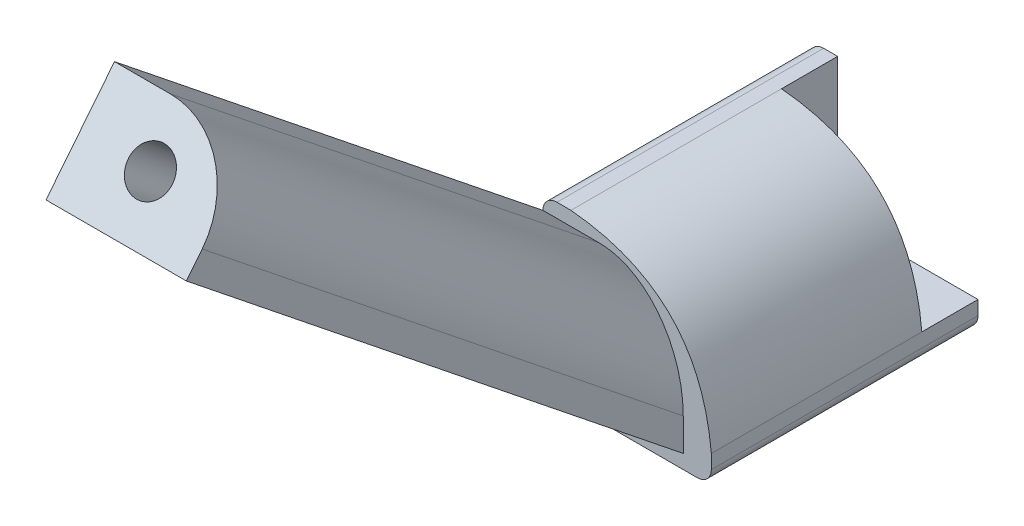
ISO-10303-21;
HEADER;
FILE_DESCRIPTION(('STEP AP214'),'2;1');
FILE_NAME('part.step','',(''),(''),'','','');
FILE_SCHEMA(('AUTOMOTIVE_DESIGN { 1 0 10303 214 1 1 1 1 }'));
ENDSEC;
DATA;
#1=APPLICATION_CONTEXT('core data for automotive mechanical design processes');
#2=APPLICATION_PROTOCOL_DEFINITION('international standard','automotive_design',2000,#1);
#3=PRODUCT_CONTEXT('',#1,'mechanical');
#4=PRODUCT('Part','Part','',(#3));
#5=PRODUCT_RELATED_PRODUCT_CATEGORY('part','',(#4));
#6=PRODUCT_DEFINITION_FORMATION('','',#4);
#7=PRODUCT_DEFINITION_CONTEXT('part definition',#1,'design');
#8=PRODUCT_DEFINITION('design','',#6,#7);
#9=PRODUCT_DEFINITION_SHAPE('','',#8);
#10=(LENGTH_UNIT() NAMED_UNIT(*) SI_UNIT(.MILLI.,.METRE.));
#11=(NAMED_UNIT(*) PLANE_ANGLE_UNIT() SI_UNIT($,.RADIAN.));
#12=(NAMED_UNIT(*) SI_UNIT($,.STERADIAN.) SOLID_ANGLE_UNIT());
#13=UNCERTAINTY_MEASURE_WITH_UNIT(LENGTH_MEASURE(1.E-05),#10,'distance_accuracy_value','');
#14=(GEOMETRIC_REPRESENTATION_CONTEXT(3) GLOBAL_UNCERTAINTY_ASSIGNED_CONTEXT((#13)) GLOBAL_UNIT_ASSIGNED_CONTEXT((#10,
#11,#12)) REPRESENTATION_CONTEXT('',''));
#15=CARTESIAN_POINT('',(0.,0.,0.));
#16=DIRECTION('',(0.,0.,1.));
#17=DIRECTION('',(1.,0.,0.));
#18=AXIS2_PLACEMENT_3D('',#15,#16,#17);
#19=CARTESIAN_POINT('',(8.98515136267974,8.98515136267974,6.35));
#20=DIRECTION('',(0.,0.,1.));
#21=DIRECTION('',(1.,0.,0.));
#22=AXIS2_PLACEMENT_3D('',#19,#20,#21);
#23=PLANE('',#22);
#24=CARTESIAN_POINT('',(5.08,5.08,6.35));
#25=DIRECTION('',(0.,0.,1.));
#26=DIRECTION('',(1.,0.,0.));
#27=AXIS2_PLACEMENT_3D('',#24,#25,#26);
#28=CIRCLE('',#27,1.2);
#29=CARTESIAN_POINT('',(6.28,5.08,6.35));
#30=VERTEX_POINT('',#29);
#31=EDGE_CURVE('E206',#30,#30,#28,.T.);
#32=ORIENTED_EDGE('',*,*,#31,.F.);
#33=EDGE_LOOP('',(#32));
#34=FACE_BOUND('',#33,.T.);
#35=CARTESIAN_POINT('',(5.08,5.08,6.35));
#36=DIRECTION('',(0.,0.,1.));
#37=DIRECTION('',(1.,0.,0.));
#38=AXIS2_PLACEMENT_3D('',#35,#36,#37);
#39=CIRCLE('',#38,3.175);
#40=CARTESIAN_POINT('',(8.255,5.08,6.35));
#41=VERTEX_POINT('',#40);
#42=EDGE_CURVE('E177',#41,#41,#39,.T.);
#43=ORIENTED_EDGE('',*,*,#42,.T.);
#44=EDGE_LOOP('',(#43));
#45=FACE_BOUND('',#44,.T.);
#46=ADVANCED_FACE('F39',(#34,#45),#23,.T.);
#47=CARTESIAN_POINT('',(8.98515136267031,8.98515136267032,0.));
#48=DIRECTION('',(0.,0.,1.));
#49=DIRECTION('',(1.,0.,0.));
#50=AXIS2_PLACEMENT_3D('',#47,#48,#49);
#51=PLANE('',#50);
#52=DIRECTION('',(0.,-1.,0.));
#53=VECTOR('',#52,1.);
#54=CARTESIAN_POINT('',(0.,0.,0.));
#55=LINE('',#54,#53);
#56=CARTESIAN_POINT('',(0.,12.7,0.));
#57=VERTEX_POINT('',#56);
#58=CARTESIAN_POINT('',(0.,0.,0.));
#59=VERTEX_POINT('',#58);
#60=EDGE_CURVE('E271',#57,#59,#55,.T.);
#61=ORIENTED_EDGE('',*,*,#60,.F.);
#62=CARTESIAN_POINT('',(12.7,0.,0.));
#63=CARTESIAN_POINT('',(11.6203027253406,11.6203027253406,0.));
#64=CARTESIAN_POINT('',(0.,12.7,0.));
#65=B_SPLINE_CURVE_WITH_KNOTS('',2,(#62,#63,#64),.UNSPECIFIED.,.F.,.F.,(3,3),(0.,1.),.UNSPECIFIED.);
#66=CARTESIAN_POINT('',(12.7,0.,0.));
#67=VERTEX_POINT('',#66);
#68=EDGE_CURVE('E431',#67,#57,#65,.T.);
#69=ORIENTED_EDGE('',*,*,#68,.F.);
#70=DIRECTION('',(1.,0.,0.));
#71=VECTOR('',#70,1.);
#72=CARTESIAN_POINT('',(0.,0.,0.));
#73=LINE('',#72,#71);
#74=EDGE_CURVE('E275',#59,#67,#73,.T.);
#75=ORIENTED_EDGE('',*,*,#74,.F.);
#76=EDGE_LOOP('',(#61,#69,#75));
#77=FACE_BOUND('',#76,.T.);
#78=CARTESIAN_POINT('',(5.08,5.08,0.));
#79=DIRECTION('',(0.,0.,1.));
#80=DIRECTION('',(1.,0.,0.));
#81=AXIS2_PLACEMENT_3D('',#78,#79,#80);
#82=CIRCLE('',#81,3.1115);
#83=CARTESIAN_POINT('',(1.9685,5.08,0.));
#84=VERTEX_POINT('',#83);
#85=EDGE_CURVE('E266',#84,#84,#82,.T.);
#86=ORIENTED_EDGE('',*,*,#85,.T.);
#87=EDGE_LOOP('',(#86));
#88=FACE_BOUND('',#87,.T.);
#89=ADVANCED_FACE('F289',(#77,#88),#51,.F.);
#90=CARTESIAN_POINT('',(12.7,0.,3.81));
#91=CARTESIAN_POINT('',(11.6203027253406,11.6203027253406,3.81));
#92=CARTESIAN_POINT('',(0.,12.7,3.81));
#93=B_SPLINE_CURVE_WITH_KNOTS('',2,(#90,#91,#92),.UNSPECIFIED.,.F.,.F.,(3,3),(0.,1.),.UNSPECIFIED.);
#94=DIRECTION('',(0.,0.,-1.));
#95=VECTOR('',#94,1.);
#96=SURFACE_OF_LINEAR_EXTRUSION('',#93,#95);
#97=ORIENTED_EDGE('',*,*,#68,.T.);
#98=DIRECTION('',(0.,0.,-1.));
#99=VECTOR('',#98,1.);
#100=CARTESIAN_POINT('',(0.,12.7,3.81));
#101=LINE('',#100,#99);
#102=CARTESIAN_POINT('',(0.,12.7,19.05));
#103=VERTEX_POINT('',#102);
#104=EDGE_CURVE('E417',#103,#57,#101,.T.);
#105=ORIENTED_EDGE('',*,*,#104,.F.);
#106=CARTESIAN_POINT('',(12.7,0.,19.05));
#107=CARTESIAN_POINT('',(11.6203027253595,11.6203027253595,19.05));
#108=CARTESIAN_POINT('',(0.,12.7,19.05));
#109=B_SPLINE_CURVE_WITH_KNOTS('',2,(#106,#107,#108),.UNSPECIFIED.,.F.,.F.,(3,3),(0.,1.),.UNSPECIFIED.);
#110=CARTESIAN_POINT('',(12.7,0.,19.05));
#111=VERTEX_POINT('',#110);
#112=EDGE_CURVE('E180',#111,#103,#109,.T.);
#113=ORIENTED_EDGE('',*,*,#112,.F.);
#114=DIRECTION('',(0.,0.,-1.));
#115=VECTOR('',#114,1.);
#116=CARTESIAN_POINT('',(12.7,0.,3.81));
#117=LINE('',#116,#115);
#118=EDGE_CURVE('E165',#111,#67,#117,.T.);
#119=ORIENTED_EDGE('',*,*,#118,.T.);
#120=EDGE_LOOP('',(#97,#105,#113,#119));
#121=FACE_BOUND('',#120,.T.);
#122=ADVANCED_FACE('F285',(#121),#96,.F.);
#123=CARTESIAN_POINT('',(5.08,5.08,3.81));
#124=DIRECTION('',(0.,0.,-1.));
#125=DIRECTION('',(-1.,0.,0.));
#126=AXIS2_PLACEMENT_3D('',#123,#124,#125);
#127=CYLINDRICAL_SURFACE('',#126,3.1115);
#128=CARTESIAN_POINT('',(5.08,5.08,3.81));
#129=DIRECTION('',(0.,0.,1.));
#130=DIRECTION('',(1.,0.,0.));
#131=AXIS2_PLACEMENT_3D('',#128,#129,#130);
#132=CIRCLE('',#131,3.1115);
#133=CARTESIAN_POINT('',(1.9685,5.08,3.81));
#134=VERTEX_POINT('',#133);
#135=EDGE_CURVE('E209',#134,#134,#132,.T.);
#136=CARTESIAN_POINT('',(1.9685,5.08,3.81));
#137=CARTESIAN_POINT('',(1.9685,5.08,3.7703125));
#138=CARTESIAN_POINT('',(1.9685,5.08,3.730625));
#139=CARTESIAN_POINT('',(1.9685,5.08,3.65125));
#140=CARTESIAN_POINT('',(1.9685,5.08,3.6115625));
#141=CARTESIAN_POINT('',(1.9685,5.08,3.5321875));
#142=CARTESIAN_POINT('',(1.9685,5.08,3.4925));
#143=CARTESIAN_POINT('',(1.9685,5.08,3.413125));
#144=CARTESIAN_POINT('',(1.9685,5.08,3.3734375));
#145=CARTESIAN_POINT('',(1.9685,5.08,3.2940625));
#146=CARTESIAN_POINT('',(1.9685,5.08,3.254375));
#147=CARTESIAN_POINT('',(1.9685,5.08,3.175));
#148=CARTESIAN_POINT('',(1.9685,5.08,3.1353125));
#149=CARTESIAN_POINT('',(1.9685,5.08,3.0559375));
#150=CARTESIAN_POINT('',(1.9685,5.08,3.01625));
#151=CARTESIAN_POINT('',(1.9685,5.08,2.936875));
#152=CARTESIAN_POINT('',(1.9685,5.08,2.8971875));
#153=CARTESIAN_POINT('',(1.9685,5.08,2.8178125));
#154=CARTESIAN_POINT('',(1.9685,5.08,2.778125));
#155=CARTESIAN_POINT('',(1.9685,5.08,2.69875));
#156=CARTESIAN_POINT('',(1.9685,5.08,2.6590625));
#157=CARTESIAN_POINT('',(1.9685,5.08,2.5796875));
#158=CARTESIAN_POINT('',(1.9685,5.08,2.54));
#159=CARTESIAN_POINT('',(1.9685,5.08,2.460625));
#160=CARTESIAN_POINT('',(1.9685,5.08,2.4209375));
#161=CARTESIAN_POINT('',(1.9685,5.08,2.3415625));
#162=CARTESIAN_POINT('',(1.9685,5.08,2.301875));
#163=CARTESIAN_POINT('',(1.9685,5.08,2.2225));
#164=CARTESIAN_POINT('',(1.9685,5.08,2.1828125));
#165=CARTESIAN_POINT('',(1.9685,5.08,2.1034375));
#166=CARTESIAN_POINT('',(1.9685,5.08,2.06375));
#167=CARTESIAN_POINT('',(1.9685,5.08,1.984375));
#168=CARTESIAN_POINT('',(1.9685,5.08,1.9446875));
#169=CARTESIAN_POINT('',(1.9685,5.08,1.8653125));
#170=CARTESIAN_POINT('',(1.9685,5.08,1.825625));
#171=CARTESIAN_POINT('',(1.9685,5.08,1.74625));
#172=CARTESIAN_POINT('',(1.9685,5.08,1.7065625));
#173=CARTESIAN_POINT('',(1.9685,5.08,1.6271875));
#174=CARTESIAN_POINT('',(1.9685,5.08,1.5875));
#175=CARTESIAN_POINT('',(1.9685,5.08,1.508125));
#176=CARTESIAN_POINT('',(1.9685,5.08,1.4684375));
#177=CARTESIAN_POINT('',(1.9685,5.08,1.3890625));
#178=CARTESIAN_POINT('',(1.9685,5.08,1.349375));
#179=CARTESIAN_POINT('',(1.9685,5.08,1.27));
#180=CARTESIAN_POINT('',(1.9685,5.08,1.2303125));
#181=CARTESIAN_POINT('',(1.9685,5.08,1.1509375));
#182=CARTESIAN_POINT('',(1.9685,5.08,1.11125));
#183=CARTESIAN_POINT('',(1.9685,5.08,1.031875));
#184=CARTESIAN_POINT('',(1.9685,5.08,0.9921875));
#185=CARTESIAN_POINT('',(1.9685,5.08,0.9128125));
#186=CARTESIAN_POINT('',(1.9685,5.08,0.873125));
#187=CARTESIAN_POINT('',(1.9685,5.08,0.79375));
#188=CARTESIAN_POINT('',(1.9685,5.08,0.7540625));
#189=CARTESIAN_POINT('',(1.9685,5.08,0.6746875));
#190=CARTESIAN_POINT('',(1.9685,5.08,0.635));
#191=CARTESIAN_POINT('',(1.9685,5.08,0.555625));
#192=CARTESIAN_POINT('',(1.9685,5.08,0.5159375));
#193=CARTESIAN_POINT('',(1.9685,5.08,0.4365625));
#194=CARTESIAN_POINT('',(1.9685,5.08,0.396875));
#195=CARTESIAN_POINT('',(1.9685,5.08,0.3175));
#196=CARTESIAN_POINT('',(1.9685,5.08,0.2778125));
#197=CARTESIAN_POINT('',(1.9685,5.08,0.1984375));
#198=CARTESIAN_POINT('',(1.9685,5.08,0.15875));
#199=CARTESIAN_POINT('',(1.9685,5.08,0.0793749999999999));
#200=CARTESIAN_POINT('',(1.9685,5.08,0.0396874999999999));
#201=CARTESIAN_POINT('',(1.9685,5.08,0.));
#202=B_SPLINE_CURVE_WITH_KNOTS('',3,(#136,#137,#138,#139,#140,#141,#142,#143,#144,#145,#146,
#147,#148,#149,#150,#151,#152,#153,#154,#155,#156,#157,#158,#159,#160,#161,#162,#163,#164,#165,
#166,#167,#168,#169,#170,#171,#172,#173,#174,#175,#176,#177,#178,#179,#180,#181,#182,#183,#184,
#185,#186,#187,#188,#189,#190,#191,#192,#193,#194,#195,#196,#197,#198,#199,#200,#201),
.UNSPECIFIED.,.F.,.F.,(4,2,2,2,2,2,2,2,2,2,2,2,2,2,2,2,2,2,2,2,2,2,2,2,2,2,2,2,2,2,2,2,4),(0.,
0.1190625,0.238125,0.3571875,0.47625,0.5953125,0.714375,0.8334375,0.9525,1.0715625,1.190625,
1.3096875,1.42875,1.5478125,1.666875,1.7859375,1.905,2.0240625,2.143125,2.2621875,2.38125,
2.5003125,2.619375,2.7384375,2.8575,2.9765625,3.095625,3.2146875,3.33375,3.4528125,3.571875,
3.6909375,3.81),.UNSPECIFIED.);
#203=EDGE_CURVE('BSEAM288',#134,#84,#202,.T.);
#204=ORIENTED_EDGE('',*,*,#135,.T.);
#205=ORIENTED_EDGE('',*,*,#85,.F.);
#206=ORIENTED_EDGE('',*,*,#203,.T.);
#207=ORIENTED_EDGE('',*,*,#203,.F.);
#208=EDGE_LOOP('',(#204,#206,#205,#207));
#209=FACE_BOUND('',#208,.T.);
#210=ADVANCED_FACE('F288',(#209),#127,.F.);
#211=CARTESIAN_POINT('',(0.,0.,3.81));
#212=DIRECTION('',(0.,1.,0.));
#213=DIRECTION('',(0.,0.,1.));
#214=AXIS2_PLACEMENT_3D('',#211,#212,#213);
#215=PLANE('',#214);
#216=ORIENTED_EDGE('',*,*,#74,.T.);
#217=DIRECTION('',(0.,0.,-1.));
#218=VECTOR('',#217,1.);
#219=CARTESIAN_POINT('',(12.7,0.,3.81));
#220=LINE('',#219,#218);
#221=CARTESIAN_POINT('',(12.7,0.,-5.08));
#222=VERTEX_POINT('',#221);
#223=EDGE_CURVE('E251',#67,#222,#220,.T.);
#224=ORIENTED_EDGE('',*,*,#223,.T.);
#225=DIRECTION('',(1.,0.,0.));
#226=VECTOR('',#225,1.);
#227=CARTESIAN_POINT('',(0.,0.,-5.08));
#228=LINE('',#227,#226);
#229=CARTESIAN_POINT('',(0.,0.,-5.08));
#230=VERTEX_POINT('',#229);
#231=EDGE_CURVE('E230',#230,#222,#228,.T.);
#232=ORIENTED_EDGE('',*,*,#231,.F.);
#233=DIRECTION('',(0.,0.,-1.));
#234=VECTOR('',#233,1.);
#235=CARTESIAN_POINT('',(0.,0.,3.81));
#236=LINE('',#235,#234);
#237=EDGE_CURVE('E244',#59,#230,#236,.T.);
#238=ORIENTED_EDGE('',*,*,#237,.F.);
#239=EDGE_LOOP('',(#216,#224,#232,#238));
#240=FACE_BOUND('',#239,.T.);
#241=ADVANCED_FACE('F296',(#240),#215,.T.);
#242=CARTESIAN_POINT('',(0.,12.7,3.81));
#243=DIRECTION('',(1.,0.,0.));
#244=DIRECTION('',(0.,0.,-1.));
#245=AXIS2_PLACEMENT_3D('',#242,#243,#244);
#246=PLANE('',#245);
#247=ORIENTED_EDGE('',*,*,#60,.T.);
#248=ORIENTED_EDGE('',*,*,#237,.T.);
#249=DIRECTION('',(0.,-1.,0.));
#250=VECTOR('',#249,1.);
#251=CARTESIAN_POINT('',(0.,12.7,-5.08));
#252=LINE('',#251,#250);
#253=CARTESIAN_POINT('',(0.,12.7,-5.08));
#254=VERTEX_POINT('',#253);
#255=EDGE_CURVE('E233',#254,#230,#252,.T.);
#256=ORIENTED_EDGE('',*,*,#255,.F.);
#257=DIRECTION('',(0.,0.,-1.));
#258=VECTOR('',#257,1.);
#259=CARTESIAN_POINT('',(0.,12.7,3.81));
#260=LINE('',#259,#258);
#261=EDGE_CURVE('E241',#57,#254,#260,.T.);
#262=ORIENTED_EDGE('',*,*,#261,.F.);
#263=EDGE_LOOP('',(#247,#248,#256,#262));
#264=FACE_BOUND('',#263,.T.);
#265=ADVANCED_FACE('F302',(#264),#246,.T.);
#266=CARTESIAN_POINT('',(-1.27,11.43,3.81));
#267=DIRECTION('',(0.,0.,-1.));
#268=DIRECTION('',(-1.,0.,0.));
#269=AXIS2_PLACEMENT_3D('',#266,#267,#268);
#270=CYLINDRICAL_SURFACE('',#269,1.27);
#271=DIRECTION('',(0.,0.,-1.));
#272=VECTOR('',#271,1.);
#273=CARTESIAN_POINT('',(-1.26999999999999,12.7,3.81));
#274=LINE('',#273,#272);
#275=CARTESIAN_POINT('',(-1.27,12.7,19.05));
#276=VERTEX_POINT('',#275);
#277=CARTESIAN_POINT('',(-1.26999999999999,12.7,-5.08));
#278=VERTEX_POINT('',#277);
#279=EDGE_CURVE('E239',#276,#278,#274,.T.);
#280=ORIENTED_EDGE('',*,*,#279,.T.);
#281=CARTESIAN_POINT('',(-1.27,11.43,-5.08));
#282=DIRECTION('',(0.,0.,1.));
#283=DIRECTION('',(1.,0.,0.));
#284=AXIS2_PLACEMENT_3D('',#281,#282,#283);
#285=CIRCLE('',#284,1.27);
#286=CARTESIAN_POINT('',(-2.54,11.43,-5.08));
#287=VERTEX_POINT('',#286);
#288=EDGE_CURVE('E212',#278,#287,#285,.T.);
#289=ORIENTED_EDGE('',*,*,#288,.T.);
#290=DIRECTION('',(0.,0.,-1.));
#291=VECTOR('',#290,1.);
#292=CARTESIAN_POINT('',(-2.54,11.43,3.81));
#293=LINE('',#292,#291);
#294=CARTESIAN_POINT('',(-2.54,11.43,19.05));
#295=VERTEX_POINT('',#294);
#296=EDGE_CURVE('E249',#295,#287,#293,.T.);
#297=ORIENTED_EDGE('',*,*,#296,.F.);
#298=CARTESIAN_POINT('',(-1.27,11.43,19.05));
#299=DIRECTION('',(0.,0.,1.));
#300=DIRECTION('',(-1.,0.,0.));
#301=AXIS2_PLACEMENT_3D('',#298,#299,#300);
#302=CIRCLE('',#301,1.27);
#303=EDGE_CURVE('E190',#276,#295,#302,.T.);
#304=ORIENTED_EDGE('',*,*,#303,.F.);
#305=EDGE_LOOP('',(#280,#289,#297,#304));
#306=FACE_BOUND('',#305,.T.);
#307=ADVANCED_FACE('F298',(#306),#270,.T.);
#308=CARTESIAN_POINT('',(-2.54,11.43,3.81));
#309=DIRECTION('',(1.,0.,0.));
#310=DIRECTION('',(0.,1.,0.));
#311=AXIS2_PLACEMENT_3D('',#308,#309,#310);
#312=PLANE('',#311);
#313=ORIENTED_EDGE('',*,*,#296,.T.);
#314=DIRECTION('',(0.,-1.,0.));
#315=VECTOR('',#314,1.);
#316=CARTESIAN_POINT('',(-2.54,11.43,-5.08));
#317=LINE('',#316,#315);
#318=CARTESIAN_POINT('',(-2.54,-1.26999999999999,-5.08));
#319=VERTEX_POINT('',#318);
#320=EDGE_CURVE('E215',#287,#319,#317,.T.);
#321=ORIENTED_EDGE('',*,*,#320,.T.);
#322=DIRECTION('',(0.,0.,-1.));
#323=VECTOR('',#322,1.);
#324=CARTESIAN_POINT('',(-2.54,-1.26999999999999,3.81));
#325=LINE('',#324,#323);
#326=CARTESIAN_POINT('',(-2.54,-1.26999999999999,19.05));
#327=VERTEX_POINT('',#326);
#328=EDGE_CURVE('E261',#327,#319,#325,.T.);
#329=ORIENTED_EDGE('',*,*,#328,.F.);
#330=DIRECTION('',(0.,0.624970196645458,0.780648610646901));
#331=VECTOR('',#330,1.);
#332=CARTESIAN_POINT('',(-2.54,-1.26999999999999,19.05));
#333=LINE('',#332,#331);
#334=CARTESIAN_POINT('',(-2.54,34.7245335055985,64.0106760815976));
#335=VERTEX_POINT('',#334);
#336=EDGE_CURVE('E166',#327,#335,#333,.T.);
#337=ORIENTED_EDGE('',*,*,#336,.T.);
#338=DIRECTION('',(0.,0.780648610646901,-0.624970196645458));
#339=VECTOR('',#338,1.);
#340=CARTESIAN_POINT('',(-2.54,34.7245335055985,64.0106760815976));
#341=LINE('',#340,#339);
#342=CARTESIAN_POINT('',(-2.54,42.4640691225712,57.8145732121188));
#343=VERTEX_POINT('',#342);
#344=EDGE_CURVE('E140',#335,#343,#341,.T.);
#345=ORIENTED_EDGE('',*,*,#344,.T.);
#346=DIRECTION('',(0.,-0.624970196645458,-0.780648610646901));
#347=VECTOR('',#346,1.);
#348=CARTESIAN_POINT('',(-2.54,11.43,19.05));
#349=LINE('',#348,#347);
#350=EDGE_CURVE('E154',#343,#295,#349,.T.);
#351=ORIENTED_EDGE('',*,*,#350,.T.);
#352=EDGE_LOOP('',(#313,#321,#329,#337,#345,#351));
#353=FACE_BOUND('',#352,.T.);
#354=ADVANCED_FACE('F301',(#353),#312,.F.);
#355=CARTESIAN_POINT('',(-1.27,-1.27,3.81));
#356=DIRECTION('',(0.,0.,-1.));
#357=DIRECTION('',(-1.,0.,0.));
#358=AXIS2_PLACEMENT_3D('',#355,#356,#357);
#359=CYLINDRICAL_SURFACE('',#358,1.27);
#360=ORIENTED_EDGE('',*,*,#328,.T.);
#361=CARTESIAN_POINT('',(-1.27,-1.27,-5.08));
#362=DIRECTION('',(0.,0.,-1.));
#363=DIRECTION('',(-1.,0.,0.));
#364=AXIS2_PLACEMENT_3D('',#361,#362,#363);
#365=CIRCLE('',#364,1.27);
#366=CARTESIAN_POINT('',(-1.26999999999999,-2.54,-5.08));
#367=VERTEX_POINT('',#366);
#368=EDGE_CURVE('E218',#367,#319,#365,.T.);
#369=ORIENTED_EDGE('',*,*,#368,.F.);
#370=DIRECTION('',(0.,0.,-1.));
#371=VECTOR('',#370,1.);
#372=CARTESIAN_POINT('',(-1.26999999999999,-2.54,3.81));
#373=LINE('',#372,#371);
#374=CARTESIAN_POINT('',(-1.26999999999999,-2.54,19.05));
#375=VERTEX_POINT('',#374);
#376=EDGE_CURVE('E260',#375,#367,#373,.T.);
#377=ORIENTED_EDGE('',*,*,#376,.F.);
#378=CARTESIAN_POINT('',(-1.27,-1.27,19.05));
#379=DIRECTION('',(0.,0.,1.));
#380=DIRECTION('',(1.,0.,0.));
#381=AXIS2_PLACEMENT_3D('',#378,#379,#380);
#382=CIRCLE('',#381,1.27);
#383=EDGE_CURVE('E193',#327,#375,#382,.T.);
#384=ORIENTED_EDGE('',*,*,#383,.F.);
#385=EDGE_LOOP('',(#360,#369,#377,#384));
#386=FACE_BOUND('',#385,.T.);
#387=ADVANCED_FACE('F306',(#386),#359,.T.);
#388=CARTESIAN_POINT('',(11.43,-2.54,3.81));
#389=DIRECTION('',(0.,-1.,0.));
#390=DIRECTION('',(0.,0.,-1.));
#391=AXIS2_PLACEMENT_3D('',#388,#389,#390);
#392=PLANE('',#391);
#393=ORIENTED_EDGE('',*,*,#376,.T.);
#394=DIRECTION('',(-1.,0.,0.));
#395=VECTOR('',#394,1.);
#396=CARTESIAN_POINT('',(11.43,-2.54,-5.08));
#397=LINE('',#396,#395);
#398=CARTESIAN_POINT('',(11.43,-2.54,-5.08));
#399=VERTEX_POINT('',#398);
#400=EDGE_CURVE('E221',#399,#367,#397,.T.);
#401=ORIENTED_EDGE('',*,*,#400,.F.);
#402=DIRECTION('',(0.,0.,-1.));
#403=VECTOR('',#402,1.);
#404=CARTESIAN_POINT('',(11.43,-2.54,3.81));
#405=LINE('',#404,#403);
#406=CARTESIAN_POINT('',(11.43,-2.54,19.05));
#407=VERTEX_POINT('',#406);
#408=EDGE_CURVE('E258',#407,#399,#405,.T.);
#409=ORIENTED_EDGE('',*,*,#408,.F.);
#410=DIRECTION('',(1.,0.,0.));
#411=VECTOR('',#410,1.);
#412=CARTESIAN_POINT('',(-1.26999999999999,-2.54,19.05));
#413=LINE('',#412,#411);
#414=EDGE_CURVE('E196',#375,#407,#413,.T.);
#415=ORIENTED_EDGE('',*,*,#414,.F.);
#416=EDGE_LOOP('',(#393,#401,#409,#415));
#417=FACE_BOUND('',#416,.T.);
#418=ADVANCED_FACE('F309',(#417),#392,.T.);
#419=CARTESIAN_POINT('',(11.43,-1.27,3.81));
#420=DIRECTION('',(0.,0.,-1.));
#421=DIRECTION('',(-1.,0.,0.));
#422=AXIS2_PLACEMENT_3D('',#419,#420,#421);
#423=CYLINDRICAL_SURFACE('',#422,1.27);
#424=ORIENTED_EDGE('',*,*,#408,.T.);
#425=CARTESIAN_POINT('',(11.43,-1.27,-5.08));
#426=DIRECTION('',(0.,0.,-1.));
#427=DIRECTION('',(-1.,0.,0.));
#428=AXIS2_PLACEMENT_3D('',#425,#426,#427);
#429=CIRCLE('',#428,1.27);
#430=CARTESIAN_POINT('',(12.7,-1.26999999999999,-5.08));
#431=VERTEX_POINT('',#430);
#432=EDGE_CURVE('E224',#431,#399,#429,.T.);
#433=ORIENTED_EDGE('',*,*,#432,.F.);
#434=DIRECTION('',(0.,0.,-1.));
#435=VECTOR('',#434,1.);
#436=CARTESIAN_POINT('',(12.7,-1.26999999999999,3.81));
#437=LINE('',#436,#435);
#438=CARTESIAN_POINT('',(12.7,-1.27,19.05));
#439=VERTEX_POINT('',#438);
#440=EDGE_CURVE('E253',#439,#431,#437,.T.);
#441=ORIENTED_EDGE('',*,*,#440,.F.);
#442=CARTESIAN_POINT('',(11.43,-1.27,19.05));
#443=DIRECTION('',(0.,0.,1.));
#444=DIRECTION('',(1.,0.,0.));
#445=AXIS2_PLACEMENT_3D('',#442,#443,#444);
#446=CIRCLE('',#445,1.27);
#447=EDGE_CURVE('E199',#407,#439,#446,.T.);
#448=ORIENTED_EDGE('',*,*,#447,.F.);
#449=EDGE_LOOP('',(#424,#433,#441,#448));
#450=FACE_BOUND('',#449,.T.);
#451=ADVANCED_FACE('F312',(#450),#423,.T.);
#452=CARTESIAN_POINT('',(12.7,0.,3.81));
#453=DIRECTION('',(1.,0.,0.));
#454=DIRECTION('',(0.,0.,-1.));
#455=AXIS2_PLACEMENT_3D('',#452,#453,#454);
#456=PLANE('',#455);
#457=ORIENTED_EDGE('',*,*,#440,.T.);
#458=DIRECTION('',(0.,-1.,0.));
#459=VECTOR('',#458,1.);
#460=CARTESIAN_POINT('',(12.7,0.,-5.08));
#461=LINE('',#460,#459);
#462=EDGE_CURVE('E227',#222,#431,#461,.T.);
#463=ORIENTED_EDGE('',*,*,#462,.F.);
#464=ORIENTED_EDGE('',*,*,#223,.F.);
#465=ORIENTED_EDGE('',*,*,#118,.F.);
#466=DIRECTION('',(0.,1.,0.));
#467=VECTOR('',#466,1.);
#468=CARTESIAN_POINT('',(12.7,-1.27,19.05));
#469=LINE('',#468,#467);
#470=EDGE_CURVE('E202',#439,#111,#469,.T.);
#471=ORIENTED_EDGE('',*,*,#470,.F.);
#472=EDGE_LOOP('',(#457,#463,#464,#465,#471));
#473=FACE_BOUND('',#472,.T.);
#474=ADVANCED_FACE('F316',(#473),#456,.T.);
#475=CARTESIAN_POINT('',(0.,12.7,3.81));
#476=DIRECTION('',(0.,-1.,0.));
#477=DIRECTION('',(0.,0.,-1.));
#478=AXIS2_PLACEMENT_3D('',#475,#476,#477);
#479=PLANE('',#478);
#480=ORIENTED_EDGE('',*,*,#104,.T.);
#481=ORIENTED_EDGE('',*,*,#261,.T.);
#482=DIRECTION('',(-1.,0.,0.));
#483=VECTOR('',#482,1.);
#484=CARTESIAN_POINT('',(0.,12.7,-5.08));
#485=LINE('',#484,#483);
#486=EDGE_CURVE('E236',#254,#278,#485,.T.);
#487=ORIENTED_EDGE('',*,*,#486,.T.);
#488=ORIENTED_EDGE('',*,*,#279,.F.);
#489=DIRECTION('',(-1.,0.,0.));
#490=VECTOR('',#489,1.);
#491=CARTESIAN_POINT('',(-1.27,12.7,19.05));
#492=LINE('',#491,#490);
#493=EDGE_CURVE('E184',#103,#276,#492,.T.);
#494=ORIENTED_EDGE('',*,*,#493,.F.);
#495=EDGE_LOOP('',(#480,#481,#487,#488,#494));
#496=FACE_BOUND('',#495,.T.);
#497=ADVANCED_FACE('F320',(#496),#479,.F.);
#498=CARTESIAN_POINT('',(-1.27,11.43,-5.08));
#499=DIRECTION('',(0.,0.,1.));
#500=DIRECTION('',(1.,0.,0.));
#501=AXIS2_PLACEMENT_3D('',#498,#499,#500);
#502=PLANE('',#501);
#503=ORIENTED_EDGE('',*,*,#288,.F.);
#504=ORIENTED_EDGE('',*,*,#486,.F.);
#505=ORIENTED_EDGE('',*,*,#255,.T.);
#506=ORIENTED_EDGE('',*,*,#231,.T.);
#507=ORIENTED_EDGE('',*,*,#462,.T.);
#508=ORIENTED_EDGE('',*,*,#432,.T.);
#509=ORIENTED_EDGE('',*,*,#400,.T.);
#510=ORIENTED_EDGE('',*,*,#368,.T.);
#511=ORIENTED_EDGE('',*,*,#320,.F.);
#512=EDGE_LOOP('',(#503,#504,#505,#506,#507,#508,#509,#510,#511));
#513=FACE_BOUND('',#512,.T.);
#514=ADVANCED_FACE('F330',(#513),#502,.F.);
#515=CARTESIAN_POINT('',(8.98515136267974,8.98515136267974,3.81));
#516=DIRECTION('',(0.,0.,1.));
#517=DIRECTION('',(1.,0.,0.));
#518=AXIS2_PLACEMENT_3D('',#515,#516,#517);
#519=PLANE('',#518);
#520=CARTESIAN_POINT('',(5.08,5.08,3.81));
#521=DIRECTION('',(0.,0.,1.));
#522=DIRECTION('',(1.,0.,0.));
#523=AXIS2_PLACEMENT_3D('',#520,#521,#522);
#524=CIRCLE('',#523,1.2);
#525=CARTESIAN_POINT('',(6.28,5.08,3.81));
#526=VERTEX_POINT('',#525);
#527=EDGE_CURVE('E205',#526,#526,#524,.T.);
#528=ORIENTED_EDGE('',*,*,#527,.T.);
#529=EDGE_LOOP('',(#528));
#530=FACE_BOUND('',#529,.T.);
#531=ORIENTED_EDGE('',*,*,#135,.F.);
#532=EDGE_LOOP('',(#531));
#533=FACE_BOUND('',#532,.T.);
#534=ADVANCED_FACE('F334',(#530,#533),#519,.F.);
#535=CARTESIAN_POINT('',(5.08,5.08,6.35));
#536=DIRECTION('',(0.,0.,-1.));
#537=DIRECTION('',(-1.,0.,0.));
#538=AXIS2_PLACEMENT_3D('',#535,#536,#537);
#539=CYLINDRICAL_SURFACE('',#538,1.2);
#540=ORIENTED_EDGE('',*,*,#31,.T.);
#541=EDGE_LOOP('',(#540));
#542=FACE_BOUND('',#541,.T.);
#543=ORIENTED_EDGE('',*,*,#527,.F.);
#544=EDGE_LOOP('',(#543));
#545=FACE_BOUND('',#544,.T.);
#546=ADVANCED_FACE('F338',(#542,#545),#539,.F.);
#547=CARTESIAN_POINT('',(8.98515136267974,8.98515136267974,19.05));
#548=DIRECTION('',(0.,0.,1.));
#549=DIRECTION('',(1.,0.,0.));
#550=AXIS2_PLACEMENT_3D('',#547,#548,#549);
#551=PLANE('',#550);
#552=DIRECTION('',(-1.,0.,0.));
#553=VECTOR('',#552,1.);
#554=CARTESIAN_POINT('',(10.16,11.43,19.05));
#555=LINE('',#554,#553);
#556=CARTESIAN_POINT('',(2.54,11.43,19.05));
#557=VERTEX_POINT('',#556);
#558=EDGE_CURVE('E164',#557,#295,#555,.T.);
#559=ORIENTED_EDGE('',*,*,#558,.F.);
#560=CARTESIAN_POINT('',(2.54,1.66888610563782,19.05));
#561=DIRECTION('',(0.,0.,1.));
#562=DIRECTION('',(0.,1.,0.));
#563=AXIS2_PLACEMENT_3D('',#560,#561,#562);
#564=ELLIPSE('',#563,9.76111389436218,7.62);
#565=CARTESIAN_POINT('',(10.16,1.66888610563782,19.05));
#566=VERTEX_POINT('',#565);
#567=EDGE_CURVE('E11',#557,#566,#564,.F.);
#568=ORIENTED_EDGE('',*,*,#567,.T.);
#569=DIRECTION('',(0.,-1.,0.));
#570=VECTOR('',#569,1.);
#571=CARTESIAN_POINT('',(10.16,11.43,19.05));
#572=LINE('',#571,#570);
#573=CARTESIAN_POINT('',(10.16,-1.26999999999999,19.05));
#574=VERTEX_POINT('',#573);
#575=EDGE_CURVE('E162',#566,#574,#572,.T.);
#576=ORIENTED_EDGE('',*,*,#575,.T.);
#577=DIRECTION('',(-1.,0.,0.));
#578=VECTOR('',#577,1.);
#579=CARTESIAN_POINT('',(10.16,-1.26999999999999,19.05));
#580=LINE('',#579,#578);
#581=EDGE_CURVE('E153',#574,#327,#580,.T.);
#582=ORIENTED_EDGE('',*,*,#581,.T.);
#583=ORIENTED_EDGE('',*,*,#383,.T.);
#584=ORIENTED_EDGE('',*,*,#414,.T.);
#585=ORIENTED_EDGE('',*,*,#447,.T.);
#586=ORIENTED_EDGE('',*,*,#470,.T.);
#587=ORIENTED_EDGE('',*,*,#112,.T.);
#588=ORIENTED_EDGE('',*,*,#493,.T.);
#589=ORIENTED_EDGE('',*,*,#303,.T.);
#590=EDGE_LOOP('',(#559,#568,#576,#582,#583,#584,#585,#586,#587,#588,#589));
#591=FACE_BOUND('',#590,.T.);
#592=ADVANCED_FACE('F345',(#591),#551,.T.);
#593=CARTESIAN_POINT('',(5.08,5.08,19.05));
#594=DIRECTION('',(0.,0.,-1.));
#595=DIRECTION('',(-1.,0.,0.));
#596=AXIS2_PLACEMENT_3D('',#593,#594,#595);
#597=CYLINDRICAL_SURFACE('',#596,3.175);
#598=CARTESIAN_POINT('',(5.08,5.08,19.05));
#599=DIRECTION('',(0.,0.,1.));
#600=DIRECTION('',(1.,0.,0.));
#601=AXIS2_PLACEMENT_3D('',#598,#599,#600);
#602=CIRCLE('',#601,3.175);
#603=CARTESIAN_POINT('',(8.255,5.08,19.05));
#604=VERTEX_POINT('',#603);
#605=EDGE_CURVE('E171',#604,#604,#602,.T.);
#606=ORIENTED_EDGE('',*,*,#605,.T.);
#607=EDGE_LOOP('',(#606));
#608=FACE_BOUND('',#607,.T.);
#609=ORIENTED_EDGE('',*,*,#42,.F.);
#610=EDGE_LOOP('',(#609));
#611=FACE_BOUND('',#610,.T.);
#612=ADVANCED_FACE('F349',(#608,#611),#597,.F.);
#613=CARTESIAN_POINT('',(10.16,0.,0.));
#614=DIRECTION('',(-1.,0.,0.));
#615=DIRECTION('',(0.,-1.,0.));
#616=AXIS2_PLACEMENT_3D('',#613,#614,#615);
#617=PLANE('',#616);
#618=ORIENTED_EDGE('',*,*,#575,.F.);
#619=DIRECTION('',(0.,-0.624970196645458,-0.780648610646902));
#620=VECTOR('',#619,1.);
#621=CARTESIAN_POINT('',(10.16,36.5155267094418,62.5768461105572));
#622=LINE('',#621,#620);
#623=CARTESIAN_POINT('',(10.16,36.5155267094418,62.5768461105572));
#624=VERTEX_POINT('',#623);
#625=EDGE_CURVE('E55',#566,#624,#622,.F.);
#626=ORIENTED_EDGE('',*,*,#625,.T.);
#627=DIRECTION('',(0.,0.780648610646901,-0.624970196645458));
#628=VECTOR('',#627,1.);
#629=CARTESIAN_POINT('',(10.16,34.7245335055985,64.0106760815976));
#630=LINE('',#629,#628);
#631=CARTESIAN_POINT('',(10.16,34.7245335055985,64.0106760815976));
#632=VERTEX_POINT('',#631);
#633=EDGE_CURVE('E137',#632,#624,#630,.T.);
#634=ORIENTED_EDGE('',*,*,#633,.F.);
#635=DIRECTION('',(0.,0.624970196645458,0.780648610646901));
#636=VECTOR('',#635,1.);
#637=CARTESIAN_POINT('',(10.16,-1.26999999999999,19.05));
#638=LINE('',#637,#636);
#639=EDGE_CURVE('E148',#574,#632,#638,.T.);
#640=ORIENTED_EDGE('',*,*,#639,.F.);
#641=EDGE_LOOP('',(#618,#626,#634,#640));
#642=FACE_BOUND('',#641,.T.);
#643=ADVANCED_FACE('F147',(#642),#617,.F.);
#644=CARTESIAN_POINT('',(10.16,34.7245335055985,64.0106760815976));
#645=DIRECTION('',(0.,0.624970196645458,0.780648610646901));
#646=DIRECTION('',(0.,-0.780648610646901,0.624970196645458));
#647=AXIS2_PLACEMENT_3D('',#644,#645,#646);
#648=PLANE('',#647);
#649=CARTESIAN_POINT('',(3.81000000000001,38.5943013140849,60.9126246468582));
#650=DIRECTION('',(0.,0.624970196645459,0.780648610646901));
#651=DIRECTION('',(0.,-0.780648610646901,0.624970196645459));
#652=AXIS2_PLACEMENT_3D('',#649,#650,#651);
#653=CIRCLE('',#652,2.000000064);
#654=CARTESIAN_POINT('',(3.81000000000001,37.0330040428295,62.1625650801473));
#655=VERTEX_POINT('',#654);
#656=EDGE_CURVE('E388',#655,#655,#653,.T.);
#657=ORIENTED_EDGE('',*,*,#656,.F.);
#658=EDGE_LOOP('',(#657));
#659=FACE_BOUND('',#658,.T.);
#660=ORIENTED_EDGE('',*,*,#633,.T.);
#661=CARTESIAN_POINT('',(2.54,36.5155267094418,62.5768461105572));
#662=DIRECTION('',(0.,0.624970196645458,0.780648610646901));
#663=DIRECTION('',(0.,-0.780648610646901,0.624970196645458));
#664=AXIS2_PLACEMENT_3D('',#661,#662,#663);
#665=CIRCLE('',#664,7.62);
#666=CARTESIAN_POINT('',(2.54,42.4640691225712,57.8145732121188));
#667=VERTEX_POINT('',#666);
#668=EDGE_CURVE('E48',#624,#667,#665,.T.);
#669=ORIENTED_EDGE('',*,*,#668,.T.);
#670=DIRECTION('',(-1.,0.,0.));
#671=VECTOR('',#670,1.);
#672=CARTESIAN_POINT('',(10.16,42.4640691225712,57.8145732121188));
#673=LINE('',#672,#671);
#674=EDGE_CURVE('E144',#667,#343,#673,.T.);
#675=ORIENTED_EDGE('',*,*,#674,.T.);
#676=ORIENTED_EDGE('',*,*,#344,.F.);
#677=DIRECTION('',(-1.,0.,0.));
#678=VECTOR('',#677,1.);
#679=CARTESIAN_POINT('',(10.16,34.7245335055985,64.0106760815976));
#680=LINE('',#679,#678);
#681=EDGE_CURVE('E135',#632,#335,#680,.T.);
#682=ORIENTED_EDGE('',*,*,#681,.F.);
#683=EDGE_LOOP('',(#660,#669,#675,#676,#682));
#684=FACE_BOUND('',#683,.T.);
#685=ADVANCED_FACE('F136',(#659,#684),#648,.T.);
#686=CARTESIAN_POINT('',(10.16,11.43,19.05));
#687=DIRECTION('',(0.,0.780648610646901,-0.624970196645458));
#688=DIRECTION('',(0.,0.624970196645458,0.780648610646902));
#689=AXIS2_PLACEMENT_3D('',#686,#687,#688);
#690=PLANE('',#689);
#691=ORIENTED_EDGE('',*,*,#674,.F.);
#692=DIRECTION('',(0.,-0.624970196645458,-0.780648610646902));
#693=VECTOR('',#692,1.);
#694=CARTESIAN_POINT('',(2.54,11.43,19.05));
#695=LINE('',#694,#693);
#696=EDGE_CURVE('E173',#667,#557,#695,.T.);
#697=ORIENTED_EDGE('',*,*,#696,.T.);
#698=ORIENTED_EDGE('',*,*,#558,.T.);
#699=ORIENTED_EDGE('',*,*,#350,.F.);
#700=EDGE_LOOP('',(#691,#697,#698,#699));
#701=FACE_BOUND('',#700,.T.);
#702=ADVANCED_FACE('F357',(#701),#690,.T.);
#703=CARTESIAN_POINT('',(10.16,-1.26999999999999,19.05));
#704=DIRECTION('',(0.,-0.780648610646901,0.624970196645458));
#705=DIRECTION('',(0.,-0.624970196645458,-0.780648610646902));
#706=AXIS2_PLACEMENT_3D('',#703,#704,#705);
#707=PLANE('',#706);
#708=CARTESIAN_POINT('',(5.08,5.08,26.9817681134481));
#709=DIRECTION('',(0.,-0.780648610646901,0.624970196645458));
#710=DIRECTION('',(0.,-0.624970196645458,-0.780648610646902));
#711=AXIS2_PLACEMENT_3D('',#708,#709,#710);
#712=ELLIPSE('',#711,4.9786374081533,3.1115);
#713=CARTESIAN_POINT('',(5.08,1.9685,23.0952017378585));
#714=VERTEX_POINT('',#713);
#715=EDGE_CURVE('E168',#714,#714,#712,.F.);
#716=ORIENTED_EDGE('',*,*,#715,.T.);
#717=EDGE_LOOP('',(#716));
#718=FACE_BOUND('',#717,.T.);
#719=ORIENTED_EDGE('',*,*,#336,.F.);
#720=ORIENTED_EDGE('',*,*,#581,.F.);
#721=ORIENTED_EDGE('',*,*,#639,.T.);
#722=ORIENTED_EDGE('',*,*,#681,.T.);
#723=EDGE_LOOP('',(#719,#720,#721,#722));
#724=FACE_BOUND('',#723,.T.);
#725=ADVANCED_FACE('F151',(#718,#724),#707,.T.);
#726=CARTESIAN_POINT('',(10.16,11.43,19.05));
#727=DIRECTION('',(0.,0.,-1.));
#728=DIRECTION('',(-1.,0.,0.));
#729=AXIS2_PLACEMENT_3D('',#726,#727,#728);
#730=PLANE('',#729);
#731=CARTESIAN_POINT('',(5.08,5.08,19.05));
#732=DIRECTION('',(0.,0.,1.));
#733=DIRECTION('',(1.,0.,0.));
#734=AXIS2_PLACEMENT_3D('',#731,#732,#733);
#735=CIRCLE('',#734,3.1115);
#736=CARTESIAN_POINT('',(8.1915,5.08,19.05));
#737=VERTEX_POINT('',#736);
#738=EDGE_CURVE('E159',#737,#737,#735,.T.);
#739=ORIENTED_EDGE('',*,*,#738,.T.);
#740=EDGE_LOOP('',(#739));
#741=FACE_BOUND('',#740,.T.);
#742=ORIENTED_EDGE('',*,*,#605,.F.);
#743=EDGE_LOOP('',(#742));
#744=FACE_BOUND('',#743,.T.);
#745=ADVANCED_FACE('F356',(#741,#744),#730,.T.);
#746=CARTESIAN_POINT('',(5.08,5.08,64.0106760815976));
#747=DIRECTION('',(0.,0.,-1.));
#748=DIRECTION('',(-1.,0.,0.));
#749=AXIS2_PLACEMENT_3D('',#746,#747,#748);
#750=CYLINDRICAL_SURFACE('',#749,3.1115);
#751=ORIENTED_EDGE('',*,*,#715,.F.);
#752=EDGE_LOOP('',(#751));
#753=FACE_BOUND('',#752,.T.);
#754=ORIENTED_EDGE('',*,*,#738,.F.);
#755=EDGE_LOOP('',(#754));
#756=FACE_BOUND('',#755,.T.);
#757=ADVANCED_FACE('F367',(#753,#756),#750,.F.);
#758=CARTESIAN_POINT('',(3.81,34.2195099563157,55.4480843957494));
#759=DIRECTION('',(0.,0.624970196645459,0.780648610646901));
#760=DIRECTION('',(0.,-0.780648610646901,0.624970196645459));
#761=AXIS2_PLACEMENT_3D('',#758,#759,#760);
#762=CYLINDRICAL_SURFACE('',#761,2.000000064);
#763=CARTESIAN_POINT('',(3.81,34.2195099563157,55.4480843957494));
#764=DIRECTION('',(0.,0.624970196645459,0.780648610646901));
#765=DIRECTION('',(0.,-0.780648610646901,0.624970196645459));
#766=AXIS2_PLACEMENT_3D('',#763,#764,#765);
#767=CIRCLE('',#766,2.000000064);
#768=CARTESIAN_POINT('',(3.81,32.6582126850604,56.6980248290384));
#769=VERTEX_POINT('',#768);
#770=EDGE_CURVE('E387',#769,#769,#767,.T.);
#771=ORIENTED_EDGE('',*,*,#770,.F.);
#772=EDGE_LOOP('',(#771));
#773=FACE_BOUND('',#772,.T.);
#774=ORIENTED_EDGE('',*,*,#656,.T.);
#775=EDGE_LOOP('',(#774));
#776=FACE_BOUND('',#775,.T.);
#777=ADVANCED_FACE('F373',(#773,#776),#762,.F.);
#778=CARTESIAN_POINT('',(3.81,34.2195099563157,55.4480843957494));
#779=DIRECTION('',(0.,0.624970196645459,0.780648610646901));
#780=DIRECTION('',(0.,-0.780648610646901,0.624970196645459));
#781=AXIS2_PLACEMENT_3D('',#778,#779,#780);
#782=PLANE('',#781);
#783=ORIENTED_EDGE('',*,*,#770,.T.);
#784=EDGE_LOOP('',(#783));
#785=FACE_BOUND('',#784,.T.);
#786=ADVANCED_FACE('F377',(#785),#782,.T.);
#787=CARTESIAN_POINT('',(2.54,5.48145758687061,23.8122728984384));
#788=DIRECTION('',(0.,0.624970196645458,0.780648610646902));
#789=DIRECTION('',(0.,-0.780648610646902,0.624970196645458));
#790=AXIS2_PLACEMENT_3D('',#787,#788,#789);
#791=CYLINDRICAL_SURFACE('',#790,7.62);
#792=ORIENTED_EDGE('',*,*,#668,.F.);
#793=ORIENTED_EDGE('',*,*,#625,.F.);
#794=ORIENTED_EDGE('',*,*,#567,.F.);
#795=ORIENTED_EDGE('',*,*,#696,.F.);
#796=EDGE_LOOP('',(#792,#793,#794,#795));
#797=FACE_BOUND('',#796,.T.);
#798=ADVANCED_FACE('F41',(#797),#791,.T.);
#799=CLOSED_SHELL('',(#46,#89,#122,#210,#241,#265,#307,#354,#387,#418,#451,#474,#497,#514,#534,
#546,#592,#612,#643,#685,#702,#725,#745,#757,#777,#786,#798));
#800=MANIFOLD_SOLID_BREP('B2',#799);
#801=ADVANCED_BREP_SHAPE_REPRESENTATION('',(#18,#800),#14);
#802=SHAPE_DEFINITION_REPRESENTATION(#9,#801);
ENDSEC;
END-ISO-10303-21;
